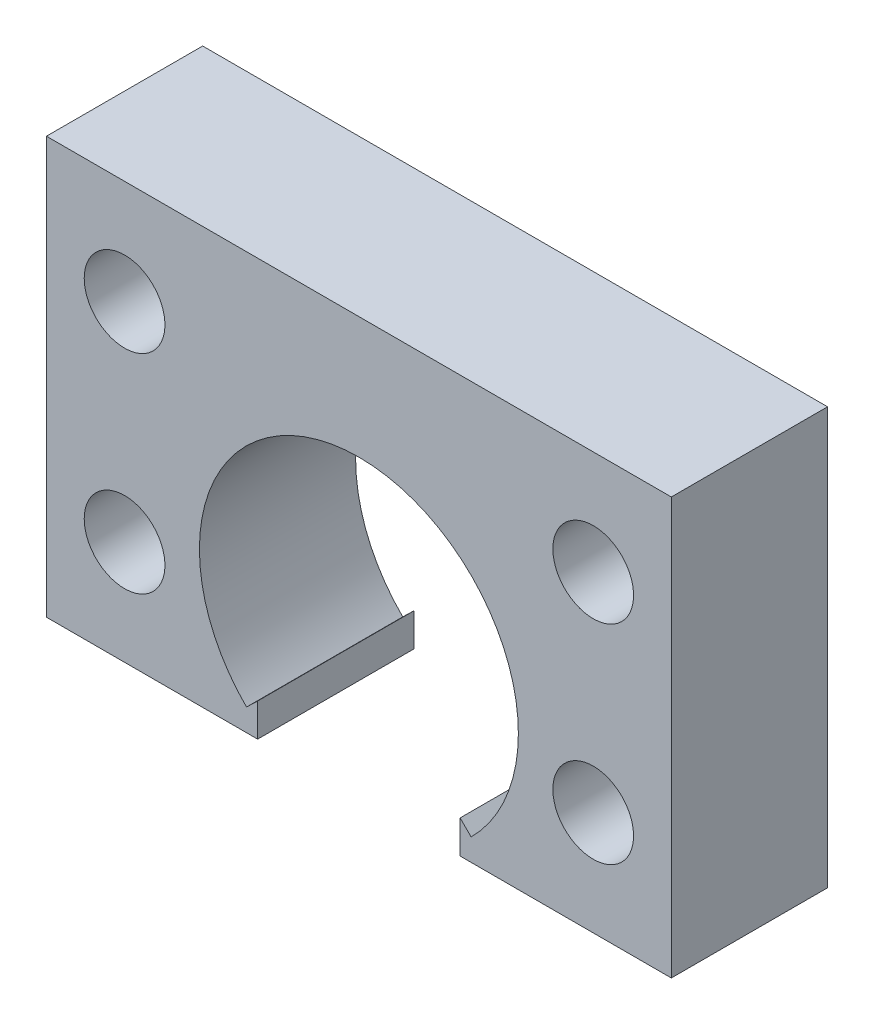
ISO-10303-21;
HEADER;
FILE_DESCRIPTION(('STEP AP214'),'2;1');
FILE_NAME('part.step','',(''),(''),'','','');
FILE_SCHEMA(('AUTOMOTIVE_DESIGN { 1 0 10303 214 1 1 1 1 }'));
ENDSEC;
DATA;
#1=APPLICATION_CONTEXT('core data for automotive mechanical design processes');
#2=APPLICATION_PROTOCOL_DEFINITION('international standard','automotive_design',2000,#1);
#3=PRODUCT_CONTEXT('',#1,'mechanical');
#4=PRODUCT('Part','Part','',(#3));
#5=PRODUCT_RELATED_PRODUCT_CATEGORY('part','',(#4));
#6=PRODUCT_DEFINITION_FORMATION('','',#4);
#7=PRODUCT_DEFINITION_CONTEXT('part definition',#1,'design');
#8=PRODUCT_DEFINITION('design','',#6,#7);
#9=PRODUCT_DEFINITION_SHAPE('','',#8);
#10=(LENGTH_UNIT() NAMED_UNIT(*) SI_UNIT(.MILLI.,.METRE.));
#11=(NAMED_UNIT(*) PLANE_ANGLE_UNIT() SI_UNIT($,.RADIAN.));
#12=(NAMED_UNIT(*) SI_UNIT($,.STERADIAN.) SOLID_ANGLE_UNIT());
#13=UNCERTAINTY_MEASURE_WITH_UNIT(LENGTH_MEASURE(1.E-05),#10,'distance_accuracy_value','');
#14=(GEOMETRIC_REPRESENTATION_CONTEXT(3) GLOBAL_UNCERTAINTY_ASSIGNED_CONTEXT((#13)) GLOBAL_UNIT_ASSIGNED_CONTEXT((#10,
#11,#12)) REPRESENTATION_CONTEXT('',''));
#15=CARTESIAN_POINT('',(0.,0.,0.));
#16=DIRECTION('',(0.,0.,1.));
#17=DIRECTION('',(1.,0.,0.));
#18=AXIS2_PLACEMENT_3D('',#15,#16,#17);
#19=CARTESIAN_POINT('',(59.5029820344726,-16.,-6.));
#20=DIRECTION('',(0.,-1.,0.));
#21=DIRECTION('',(0.,0.,-1.));
#22=AXIS2_PLACEMENT_3D('',#19,#20,#21);
#23=PLANE('',#22);
#24=DIRECTION('',(1.,0.,0.));
#25=VECTOR('',#24,1.);
#26=CARTESIAN_POINT('',(59.5029820344726,-16.,0.));
#27=LINE('',#26,#25);
#28=CARTESIAN_POINT('',(51.3914264535173,-16.,0.));
#29=VERTEX_POINT('',#28);
#30=CARTESIAN_POINT('',(59.5029820344726,-16.,0.));
#31=VERTEX_POINT('',#30);
#32=EDGE_CURVE('E84',#29,#31,#27,.T.);
#33=ORIENTED_EDGE('',*,*,#32,.F.);
#34=DIRECTION('',(0.,0.,-1.));
#35=VECTOR('',#34,1.);
#36=CARTESIAN_POINT('',(51.3914264535173,-16.,0.));
#37=LINE('',#36,#35);
#38=CARTESIAN_POINT('',(51.3914264535173,-16.,-6.));
#39=VERTEX_POINT('',#38);
#40=EDGE_CURVE('E123',#29,#39,#37,.T.);
#41=ORIENTED_EDGE('',*,*,#40,.T.);
#42=DIRECTION('',(1.,0.,0.));
#43=VECTOR('',#42,1.);
#44=CARTESIAN_POINT('',(59.5029820344726,-16.,-6.));
#45=LINE('',#44,#43);
#46=CARTESIAN_POINT('',(59.5029820344726,-16.,-6.));
#47=VERTEX_POINT('',#46);
#48=EDGE_CURVE('E61',#39,#47,#45,.T.);
#49=ORIENTED_EDGE('',*,*,#48,.T.);
#50=DIRECTION('',(0.,0.,1.));
#51=VECTOR('',#50,1.);
#52=CARTESIAN_POINT('',(59.5029820344726,-16.,-6.));
#53=LINE('',#52,#51);
#54=EDGE_CURVE('E11',#47,#31,#53,.T.);
#55=ORIENTED_EDGE('',*,*,#54,.T.);
#56=EDGE_LOOP('',(#33,#41,#49,#55));
#57=FACE_BOUND('',#56,.T.);
#58=ADVANCED_FACE('F36',(#57),#23,.T.);
#59=CARTESIAN_POINT('',(35.5029820344726,-16.,-6.));
#60=VERTEX_POINT('',#59);
#61=CARTESIAN_POINT('',(43.6145376154278,-16.,-6.));
#62=VERTEX_POINT('',#61);
#63=EDGE_CURVE('E151',#60,#62,#45,.T.);
#64=ORIENTED_EDGE('',*,*,#63,.T.);
#65=DIRECTION('',(0.,0.,-1.));
#66=VECTOR('',#65,1.);
#67=CARTESIAN_POINT('',(43.6145376154278,-16.,0.));
#68=LINE('',#67,#66);
#69=CARTESIAN_POINT('',(43.6145376154278,-16.,0.));
#70=VERTEX_POINT('',#69);
#71=EDGE_CURVE('E257',#70,#62,#68,.T.);
#72=ORIENTED_EDGE('',*,*,#71,.F.);
#73=CARTESIAN_POINT('',(35.5029820344726,-16.,0.));
#74=VERTEX_POINT('',#73);
#75=EDGE_CURVE('E139',#74,#70,#27,.T.);
#76=ORIENTED_EDGE('',*,*,#75,.F.);
#77=DIRECTION('',(0.,0.,1.));
#78=VECTOR('',#77,1.);
#79=CARTESIAN_POINT('',(35.5029820344726,-16.,-6.));
#80=LINE('',#79,#78);
#81=EDGE_CURVE('E45',#60,#74,#80,.T.);
#82=ORIENTED_EDGE('',*,*,#81,.F.);
#83=EDGE_LOOP('',(#64,#72,#76,#82));
#84=FACE_BOUND('',#83,.T.);
#85=ADVANCED_FACE('F178',(#84),#23,.T.);
#86=CARTESIAN_POINT('',(0.,0.,-6.));
#87=DIRECTION('',(0.,0.,-1.));
#88=DIRECTION('',(-1.,0.,0.));
#89=AXIS2_PLACEMENT_3D('',#86,#87,#88);
#90=PLANE('',#89);
#91=CARTESIAN_POINT('',(38.5029820344725,-12.,-6.));
#92=DIRECTION('',(0.,0.,-1.));
#93=DIRECTION('',(-1.,0.,0.));
#94=AXIS2_PLACEMENT_3D('',#91,#92,#93);
#95=CIRCLE('',#94,1.55);
#96=CARTESIAN_POINT('',(36.9529820344725,-12.,-6.));
#97=VERTEX_POINT('',#96);
#98=EDGE_CURVE('E228',#97,#97,#95,.T.);
#99=ORIENTED_EDGE('',*,*,#98,.F.);
#100=EDGE_LOOP('',(#99));
#101=FACE_BOUND('',#100,.T.);
#102=CARTESIAN_POINT('',(38.5029820344725,-4.00000000000001,-6.));
#103=DIRECTION('',(0.,0.,-1.));
#104=DIRECTION('',(-1.,0.,0.));
#105=AXIS2_PLACEMENT_3D('',#102,#103,#104);
#106=CIRCLE('',#105,1.55);
#107=CARTESIAN_POINT('',(36.9529820344725,-4.00000000000001,-6.));
#108=VERTEX_POINT('',#107);
#109=EDGE_CURVE('E230',#108,#108,#106,.T.);
#110=ORIENTED_EDGE('',*,*,#109,.F.);
#111=EDGE_LOOP('',(#110));
#112=FACE_BOUND('',#111,.T.);
#113=CARTESIAN_POINT('',(56.5029820344725,-4.00000000000001,-6.));
#114=DIRECTION('',(0.,0.,-1.));
#115=DIRECTION('',(-1.,0.,0.));
#116=AXIS2_PLACEMENT_3D('',#113,#114,#115);
#117=CIRCLE('',#116,1.54999999999999);
#118=CARTESIAN_POINT('',(54.9529820344725,-4.00000000000001,-6.));
#119=VERTEX_POINT('',#118);
#120=EDGE_CURVE('E236',#119,#119,#117,.T.);
#121=ORIENTED_EDGE('',*,*,#120,.F.);
#122=EDGE_LOOP('',(#121));
#123=FACE_BOUND('',#122,.T.);
#124=CARTESIAN_POINT('',(56.5029820344725,-12.,-6.));
#125=DIRECTION('',(0.,0.,-1.));
#126=DIRECTION('',(-1.,0.,0.));
#127=AXIS2_PLACEMENT_3D('',#124,#125,#126);
#128=CIRCLE('',#127,1.54999999999999);
#129=CARTESIAN_POINT('',(54.9529820344725,-12.,-6.));
#130=VERTEX_POINT('',#129);
#131=EDGE_CURVE('E242',#130,#130,#128,.T.);
#132=ORIENTED_EDGE('',*,*,#131,.F.);
#133=EDGE_LOOP('',(#132));
#134=FACE_BOUND('',#133,.T.);
#135=ORIENTED_EDGE('',*,*,#48,.F.);
#136=DIRECTION('',(0.,1.,0.));
#137=VECTOR('',#136,1.);
#138=CARTESIAN_POINT('',(51.3914264535173,-16.,-6.));
#139=LINE('',#138,#137);
#140=CARTESIAN_POINT('',(51.3914264535173,-14.7305411481388,-6.));
#141=VERTEX_POINT('',#140);
#142=EDGE_CURVE('E128',#39,#141,#139,.T.);
#143=ORIENTED_EDGE('',*,*,#142,.T.);
#144=DIRECTION('',(0.706962045319872,-0.707251487433673,0.));
#145=VECTOR('',#144,1.);
#146=CARTESIAN_POINT('',(51.3914264535173,-14.7305411481388,-6.));
#147=LINE('',#146,#145);
#148=CARTESIAN_POINT('',(51.8128248740396,-15.1521120962393,-6.));
#149=VERTEX_POINT('',#148);
#150=EDGE_CURVE('E259',#141,#149,#147,.T.);
#151=ORIENTED_EDGE('',*,*,#150,.T.);
#152=CARTESIAN_POINT('',(47.5029820344726,-10.8,-6.));
#153=DIRECTION('',(0.,0.,1.));
#154=DIRECTION('',(1.,0.,0.));
#155=AXIS2_PLACEMENT_3D('',#152,#153,#154);
#156=CIRCLE('',#155,6.125);
#157=CARTESIAN_POINT('',(43.1867802462308,-15.1458056932149,-6.));
#158=VERTEX_POINT('',#157);
#159=EDGE_CURVE('E262',#149,#158,#156,.T.);
#160=ORIENTED_EDGE('',*,*,#159,.T.);
#161=DIRECTION('',(0.717506685731035,0.696551617564172,0.));
#162=VECTOR('',#161,1.);
#163=CARTESIAN_POINT('',(43.6145376154278,-14.7305411481388,-6.));
#164=LINE('',#163,#162);
#165=CARTESIAN_POINT('',(43.6145376154278,-14.7305411481388,-6.));
#166=VERTEX_POINT('',#165);
#167=EDGE_CURVE('E265',#158,#166,#164,.T.);
#168=ORIENTED_EDGE('',*,*,#167,.T.);
#169=DIRECTION('',(0.,-1.,0.));
#170=VECTOR('',#169,1.);
#171=CARTESIAN_POINT('',(43.6145376154278,-16.,-6.));
#172=LINE('',#171,#170);
#173=EDGE_CURVE('E136',#166,#62,#172,.T.);
#174=ORIENTED_EDGE('',*,*,#173,.T.);
#175=ORIENTED_EDGE('',*,*,#63,.F.);
#176=DIRECTION('',(0.,-1.,0.));
#177=VECTOR('',#176,1.);
#178=CARTESIAN_POINT('',(35.5029820344726,0.,-6.));
#179=LINE('',#178,#177);
#180=CARTESIAN_POINT('',(35.5029820344726,0.,-6.));
#181=VERTEX_POINT('',#180);
#182=EDGE_CURVE('E159',#181,#60,#179,.T.);
#183=ORIENTED_EDGE('',*,*,#182,.F.);
#184=DIRECTION('',(-1.,0.,0.));
#185=VECTOR('',#184,1.);
#186=CARTESIAN_POINT('',(59.5029820344726,0.,-6.));
#187=LINE('',#186,#185);
#188=CARTESIAN_POINT('',(59.5029820344726,0.,-6.));
#189=VERTEX_POINT('',#188);
#190=EDGE_CURVE('E278',#189,#181,#187,.T.);
#191=ORIENTED_EDGE('',*,*,#190,.F.);
#192=DIRECTION('',(0.,1.,0.));
#193=VECTOR('',#192,1.);
#194=CARTESIAN_POINT('',(59.5029820344726,0.,-6.));
#195=LINE('',#194,#193);
#196=EDGE_CURVE('E143',#47,#189,#195,.T.);
#197=ORIENTED_EDGE('',*,*,#196,.F.);
#198=EDGE_LOOP('',(#135,#143,#151,#160,#168,#174,#175,#183,#191,#197));
#199=FACE_BOUND('',#198,.T.);
#200=ADVANCED_FACE('F183',(#101,#112,#123,#134,#199),#90,.T.);
#201=CARTESIAN_POINT('',(0.,0.,0.));
#202=DIRECTION('',(0.,0.,-1.));
#203=DIRECTION('',(-1.,0.,0.));
#204=AXIS2_PLACEMENT_3D('',#201,#202,#203);
#205=PLANE('',#204);
#206=CARTESIAN_POINT('',(38.5029820344725,-12.,0.));
#207=DIRECTION('',(0.,0.,-1.));
#208=DIRECTION('',(-1.,0.,0.));
#209=AXIS2_PLACEMENT_3D('',#206,#207,#208);
#210=CIRCLE('',#209,1.55);
#211=CARTESIAN_POINT('',(36.9529820344725,-12.,0.));
#212=VERTEX_POINT('',#211);
#213=EDGE_CURVE('E225',#212,#212,#210,.T.);
#214=ORIENTED_EDGE('',*,*,#213,.T.);
#215=EDGE_LOOP('',(#214));
#216=FACE_BOUND('',#215,.T.);
#217=CARTESIAN_POINT('',(38.5029820344725,-4.00000000000001,0.));
#218=DIRECTION('',(0.,0.,-1.));
#219=DIRECTION('',(-1.,0.,0.));
#220=AXIS2_PLACEMENT_3D('',#217,#218,#219);
#221=CIRCLE('',#220,1.55);
#222=CARTESIAN_POINT('',(36.9529820344725,-4.00000000000001,0.));
#223=VERTEX_POINT('',#222);
#224=EDGE_CURVE('E233',#223,#223,#221,.T.);
#225=ORIENTED_EDGE('',*,*,#224,.T.);
#226=EDGE_LOOP('',(#225));
#227=FACE_BOUND('',#226,.T.);
#228=CARTESIAN_POINT('',(56.5029820344725,-4.00000000000001,0.));
#229=DIRECTION('',(0.,0.,-1.));
#230=DIRECTION('',(-1.,0.,0.));
#231=AXIS2_PLACEMENT_3D('',#228,#229,#230);
#232=CIRCLE('',#231,1.54999999999999);
#233=CARTESIAN_POINT('',(54.9529820344725,-4.00000000000001,0.));
#234=VERTEX_POINT('',#233);
#235=EDGE_CURVE('E239',#234,#234,#232,.T.);
#236=ORIENTED_EDGE('',*,*,#235,.T.);
#237=EDGE_LOOP('',(#236));
#238=FACE_BOUND('',#237,.T.);
#239=CARTESIAN_POINT('',(56.5029820344725,-12.,0.));
#240=DIRECTION('',(0.,0.,-1.));
#241=DIRECTION('',(-1.,0.,0.));
#242=AXIS2_PLACEMENT_3D('',#239,#240,#241);
#243=CIRCLE('',#242,1.54999999999999);
#244=CARTESIAN_POINT('',(54.9529820344725,-12.,0.));
#245=VERTEX_POINT('',#244);
#246=EDGE_CURVE('E245',#245,#245,#243,.T.);
#247=ORIENTED_EDGE('',*,*,#246,.T.);
#248=EDGE_LOOP('',(#247));
#249=FACE_BOUND('',#248,.T.);
#250=DIRECTION('',(0.,1.,0.));
#251=VECTOR('',#250,1.);
#252=CARTESIAN_POINT('',(51.3914264535173,-16.,0.));
#253=LINE('',#252,#251);
#254=CARTESIAN_POINT('',(51.3914264535173,-14.7305411481388,0.));
#255=VERTEX_POINT('',#254);
#256=EDGE_CURVE('E125',#29,#255,#253,.T.);
#257=ORIENTED_EDGE('',*,*,#256,.F.);
#258=ORIENTED_EDGE('',*,*,#32,.T.);
#259=DIRECTION('',(0.,1.,0.));
#260=VECTOR('',#259,1.);
#261=CARTESIAN_POINT('',(59.5029820344726,0.,0.));
#262=LINE('',#261,#260);
#263=CARTESIAN_POINT('',(59.5029820344726,0.,0.));
#264=VERTEX_POINT('',#263);
#265=EDGE_CURVE('E129',#31,#264,#262,.T.);
#266=ORIENTED_EDGE('',*,*,#265,.T.);
#267=DIRECTION('',(-1.,0.,0.));
#268=VECTOR('',#267,1.);
#269=CARTESIAN_POINT('',(59.5029820344726,0.,0.));
#270=LINE('',#269,#268);
#271=CARTESIAN_POINT('',(35.5029820344726,0.,0.));
#272=VERTEX_POINT('',#271);
#273=EDGE_CURVE('E145',#264,#272,#270,.T.);
#274=ORIENTED_EDGE('',*,*,#273,.T.);
#275=DIRECTION('',(0.,-1.,0.));
#276=VECTOR('',#275,1.);
#277=CARTESIAN_POINT('',(35.5029820344726,0.,0.));
#278=LINE('',#277,#276);
#279=EDGE_CURVE('E140',#272,#74,#278,.T.);
#280=ORIENTED_EDGE('',*,*,#279,.T.);
#281=ORIENTED_EDGE('',*,*,#75,.T.);
#282=DIRECTION('',(0.,-1.,0.));
#283=VECTOR('',#282,1.);
#284=CARTESIAN_POINT('',(43.6145376154278,-16.,0.));
#285=LINE('',#284,#283);
#286=CARTESIAN_POINT('',(43.6145376154278,-14.7305411481388,0.));
#287=VERTEX_POINT('',#286);
#288=EDGE_CURVE('E255',#287,#70,#285,.T.);
#289=ORIENTED_EDGE('',*,*,#288,.F.);
#290=DIRECTION('',(0.717506685731035,0.696551617564172,0.));
#291=VECTOR('',#290,1.);
#292=CARTESIAN_POINT('',(43.6145376154278,-14.7305411481388,0.));
#293=LINE('',#292,#291);
#294=CARTESIAN_POINT('',(43.1867802462308,-15.1458056932149,0.));
#295=VERTEX_POINT('',#294);
#296=EDGE_CURVE('E253',#295,#287,#293,.T.);
#297=ORIENTED_EDGE('',*,*,#296,.F.);
#298=CARTESIAN_POINT('',(47.5029820344726,-10.8,0.));
#299=DIRECTION('',(0.,0.,1.));
#300=DIRECTION('',(-1.,0.,0.));
#301=AXIS2_PLACEMENT_3D('',#298,#299,#300);
#302=CIRCLE('',#301,6.125);
#303=CARTESIAN_POINT('',(51.8128248740396,-15.1521120962393,0.));
#304=VERTEX_POINT('',#303);
#305=EDGE_CURVE('E251',#304,#295,#302,.T.);
#306=ORIENTED_EDGE('',*,*,#305,.F.);
#307=DIRECTION('',(0.706962045319872,-0.707251487433673,0.));
#308=VECTOR('',#307,1.);
#309=CARTESIAN_POINT('',(51.3914264535173,-14.7305411481388,0.));
#310=LINE('',#309,#308);
#311=EDGE_CURVE('E135',#255,#304,#310,.T.);
#312=ORIENTED_EDGE('',*,*,#311,.F.);
#313=EDGE_LOOP('',(#257,#258,#266,#274,#280,#281,#289,#297,#306,#312));
#314=FACE_BOUND('',#313,.T.);
#315=ADVANCED_FACE('F133',(#216,#227,#238,#249,#314),#205,.F.);
#316=CARTESIAN_POINT('',(59.5029820344726,0.,-6.));
#317=DIRECTION('',(1.,0.,0.));
#318=DIRECTION('',(0.,1.,0.));
#319=AXIS2_PLACEMENT_3D('',#316,#317,#318);
#320=PLANE('',#319);
#321=ORIENTED_EDGE('',*,*,#265,.F.);
#322=ORIENTED_EDGE('',*,*,#54,.F.);
#323=ORIENTED_EDGE('',*,*,#196,.T.);
#324=DIRECTION('',(0.,0.,1.));
#325=VECTOR('',#324,1.);
#326=CARTESIAN_POINT('',(59.5029820344726,0.,-6.));
#327=LINE('',#326,#325);
#328=EDGE_CURVE('E40',#189,#264,#327,.T.);
#329=ORIENTED_EDGE('',*,*,#328,.T.);
#330=EDGE_LOOP('',(#321,#322,#323,#329));
#331=FACE_BOUND('',#330,.T.);
#332=ADVANCED_FACE('F38',(#331),#320,.T.);
#333=CARTESIAN_POINT('',(35.5029820344726,0.,-6.));
#334=DIRECTION('',(-1.,0.,0.));
#335=DIRECTION('',(0.,0.,1.));
#336=AXIS2_PLACEMENT_3D('',#333,#334,#335);
#337=PLANE('',#336);
#338=ORIENTED_EDGE('',*,*,#279,.F.);
#339=DIRECTION('',(0.,0.,1.));
#340=VECTOR('',#339,1.);
#341=CARTESIAN_POINT('',(35.5029820344726,0.,-6.));
#342=LINE('',#341,#340);
#343=EDGE_CURVE('E149',#181,#272,#342,.T.);
#344=ORIENTED_EDGE('',*,*,#343,.F.);
#345=ORIENTED_EDGE('',*,*,#182,.T.);
#346=ORIENTED_EDGE('',*,*,#81,.T.);
#347=EDGE_LOOP('',(#338,#344,#345,#346));
#348=FACE_BOUND('',#347,.T.);
#349=ADVANCED_FACE('F168',(#348),#337,.T.);
#350=CARTESIAN_POINT('',(59.5029820344726,0.,-6.));
#351=DIRECTION('',(0.,1.,0.));
#352=DIRECTION('',(-1.,0.,0.));
#353=AXIS2_PLACEMENT_3D('',#350,#351,#352);
#354=PLANE('',#353);
#355=ORIENTED_EDGE('',*,*,#273,.F.);
#356=ORIENTED_EDGE('',*,*,#328,.F.);
#357=ORIENTED_EDGE('',*,*,#190,.T.);
#358=ORIENTED_EDGE('',*,*,#343,.T.);
#359=EDGE_LOOP('',(#355,#356,#357,#358));
#360=FACE_BOUND('',#359,.T.);
#361=ADVANCED_FACE('F166',(#360),#354,.T.);
#362=CARTESIAN_POINT('',(51.3914264535173,-16.,0.));
#363=DIRECTION('',(-1.,0.,0.));
#364=DIRECTION('',(0.,0.,1.));
#365=AXIS2_PLACEMENT_3D('',#362,#363,#364);
#366=PLANE('',#365);
#367=ORIENTED_EDGE('',*,*,#142,.F.);
#368=ORIENTED_EDGE('',*,*,#40,.F.);
#369=ORIENTED_EDGE('',*,*,#256,.T.);
#370=DIRECTION('',(0.,0.,-1.));
#371=VECTOR('',#370,1.);
#372=CARTESIAN_POINT('',(51.3914264535173,-14.7305411481388,0.));
#373=LINE('',#372,#371);
#374=EDGE_CURVE('E130',#255,#141,#373,.T.);
#375=ORIENTED_EDGE('',*,*,#374,.T.);
#376=EDGE_LOOP('',(#367,#368,#369,#375));
#377=FACE_BOUND('',#376,.T.);
#378=ADVANCED_FACE('F124',(#377),#366,.T.);
#379=CARTESIAN_POINT('',(51.3914264535173,-14.7305411481388,0.));
#380=DIRECTION('',(0.707251487433673,0.706962045319872,0.));
#381=DIRECTION('',(-0.706962045319872,0.707251487433673,0.));
#382=AXIS2_PLACEMENT_3D('',#379,#380,#381);
#383=PLANE('',#382);
#384=ORIENTED_EDGE('',*,*,#150,.F.);
#385=ORIENTED_EDGE('',*,*,#374,.F.);
#386=ORIENTED_EDGE('',*,*,#311,.T.);
#387=DIRECTION('',(0.,0.,-1.));
#388=VECTOR('',#387,1.);
#389=CARTESIAN_POINT('',(51.8128248740396,-15.1521120962393,0.));
#390=LINE('',#389,#388);
#391=EDGE_CURVE('E274',#304,#149,#390,.T.);
#392=ORIENTED_EDGE('',*,*,#391,.T.);
#393=EDGE_LOOP('',(#384,#385,#386,#392));
#394=FACE_BOUND('',#393,.T.);
#395=ADVANCED_FACE('F173',(#394),#383,.T.);
#396=CARTESIAN_POINT('',(47.5029820344726,-10.8,0.));
#397=DIRECTION('',(0.,0.,-1.));
#398=DIRECTION('',(-1.,0.,0.));
#399=AXIS2_PLACEMENT_3D('',#396,#397,#398);
#400=CYLINDRICAL_SURFACE('',#399,6.125);
#401=ORIENTED_EDGE('',*,*,#159,.F.);
#402=ORIENTED_EDGE('',*,*,#391,.F.);
#403=ORIENTED_EDGE('',*,*,#305,.T.);
#404=DIRECTION('',(0.,0.,-1.));
#405=VECTOR('',#404,1.);
#406=CARTESIAN_POINT('',(43.1867802462308,-15.1458056932149,0.));
#407=LINE('',#406,#405);
#408=EDGE_CURVE('E272',#295,#158,#407,.T.);
#409=ORIENTED_EDGE('',*,*,#408,.T.);
#410=EDGE_LOOP('',(#401,#402,#403,#409));
#411=FACE_BOUND('',#410,.T.);
#412=ADVANCED_FACE('F193',(#411),#400,.F.);
#413=CARTESIAN_POINT('',(43.6145376154278,-14.7305411481388,0.));
#414=DIRECTION('',(-0.696551617564172,0.717506685731035,0.));
#415=DIRECTION('',(-0.717506685731035,-0.696551617564172,0.));
#416=AXIS2_PLACEMENT_3D('',#413,#414,#415);
#417=PLANE('',#416);
#418=ORIENTED_EDGE('',*,*,#167,.F.);
#419=ORIENTED_EDGE('',*,*,#408,.F.);
#420=ORIENTED_EDGE('',*,*,#296,.T.);
#421=DIRECTION('',(0.,0.,-1.));
#422=VECTOR('',#421,1.);
#423=CARTESIAN_POINT('',(43.6145376154278,-14.7305411481388,0.));
#424=LINE('',#423,#422);
#425=EDGE_CURVE('E53',#287,#166,#424,.T.);
#426=ORIENTED_EDGE('',*,*,#425,.T.);
#427=EDGE_LOOP('',(#418,#419,#420,#426));
#428=FACE_BOUND('',#427,.T.);
#429=ADVANCED_FACE('F197',(#428),#417,.T.);
#430=CARTESIAN_POINT('',(43.6145376154278,-16.,0.));
#431=DIRECTION('',(1.,0.,0.));
#432=DIRECTION('',(0.,0.,-1.));
#433=AXIS2_PLACEMENT_3D('',#430,#431,#432);
#434=PLANE('',#433);
#435=ORIENTED_EDGE('',*,*,#173,.F.);
#436=ORIENTED_EDGE('',*,*,#425,.F.);
#437=ORIENTED_EDGE('',*,*,#288,.T.);
#438=ORIENTED_EDGE('',*,*,#71,.T.);
#439=EDGE_LOOP('',(#435,#436,#437,#438));
#440=FACE_BOUND('',#439,.T.);
#441=ADVANCED_FACE('F201',(#440),#434,.T.);
#442=CARTESIAN_POINT('',(56.5029820344725,-12.,0.));
#443=DIRECTION('',(0.,0.,-1.));
#444=DIRECTION('',(-1.,0.,0.));
#445=AXIS2_PLACEMENT_3D('',#442,#443,#444);
#446=CYLINDRICAL_SURFACE('',#445,1.54999999999999);
#447=ORIENTED_EDGE('',*,*,#246,.F.);
#448=EDGE_LOOP('',(#447));
#449=FACE_BOUND('',#448,.T.);
#450=ORIENTED_EDGE('',*,*,#131,.T.);
#451=EDGE_LOOP('',(#450));
#452=FACE_BOUND('',#451,.T.);
#453=ADVANCED_FACE('F205',(#449,#452),#446,.F.);
#454=CARTESIAN_POINT('',(56.5029820344725,-4.00000000000001,0.));
#455=DIRECTION('',(0.,0.,-1.));
#456=DIRECTION('',(-1.,0.,0.));
#457=AXIS2_PLACEMENT_3D('',#454,#455,#456);
#458=CYLINDRICAL_SURFACE('',#457,1.54999999999999);
#459=ORIENTED_EDGE('',*,*,#235,.F.);
#460=EDGE_LOOP('',(#459));
#461=FACE_BOUND('',#460,.T.);
#462=ORIENTED_EDGE('',*,*,#120,.T.);
#463=EDGE_LOOP('',(#462));
#464=FACE_BOUND('',#463,.T.);
#465=ADVANCED_FACE('F208',(#461,#464),#458,.F.);
#466=CARTESIAN_POINT('',(38.5029820344725,-4.00000000000001,0.));
#467=DIRECTION('',(0.,0.,-1.));
#468=DIRECTION('',(-1.,0.,0.));
#469=AXIS2_PLACEMENT_3D('',#466,#467,#468);
#470=CYLINDRICAL_SURFACE('',#469,1.55);
#471=ORIENTED_EDGE('',*,*,#224,.F.);
#472=EDGE_LOOP('',(#471));
#473=FACE_BOUND('',#472,.T.);
#474=ORIENTED_EDGE('',*,*,#109,.T.);
#475=EDGE_LOOP('',(#474));
#476=FACE_BOUND('',#475,.T.);
#477=ADVANCED_FACE('F212',(#473,#476),#470,.F.);
#478=CARTESIAN_POINT('',(38.5029820344725,-12.,0.));
#479=DIRECTION('',(0.,0.,-1.));
#480=DIRECTION('',(-1.,0.,0.));
#481=AXIS2_PLACEMENT_3D('',#478,#479,#480);
#482=CYLINDRICAL_SURFACE('',#481,1.55);
#483=ORIENTED_EDGE('',*,*,#213,.F.);
#484=EDGE_LOOP('',(#483));
#485=FACE_BOUND('',#484,.T.);
#486=ORIENTED_EDGE('',*,*,#98,.T.);
#487=EDGE_LOOP('',(#486));
#488=FACE_BOUND('',#487,.T.);
#489=ADVANCED_FACE('F216',(#485,#488),#482,.F.);
#490=CLOSED_SHELL('',(#58,#85,#200,#315,#332,#349,#361,#378,#395,#412,#429,#441,#453,#465,#477,#489));
#491=MANIFOLD_SOLID_BREP('B2',#490);
#492=ADVANCED_BREP_SHAPE_REPRESENTATION('',(#18,#491),#14);
#493=SHAPE_DEFINITION_REPRESENTATION(#9,#492);
ENDSEC;
END-ISO-10303-21;
